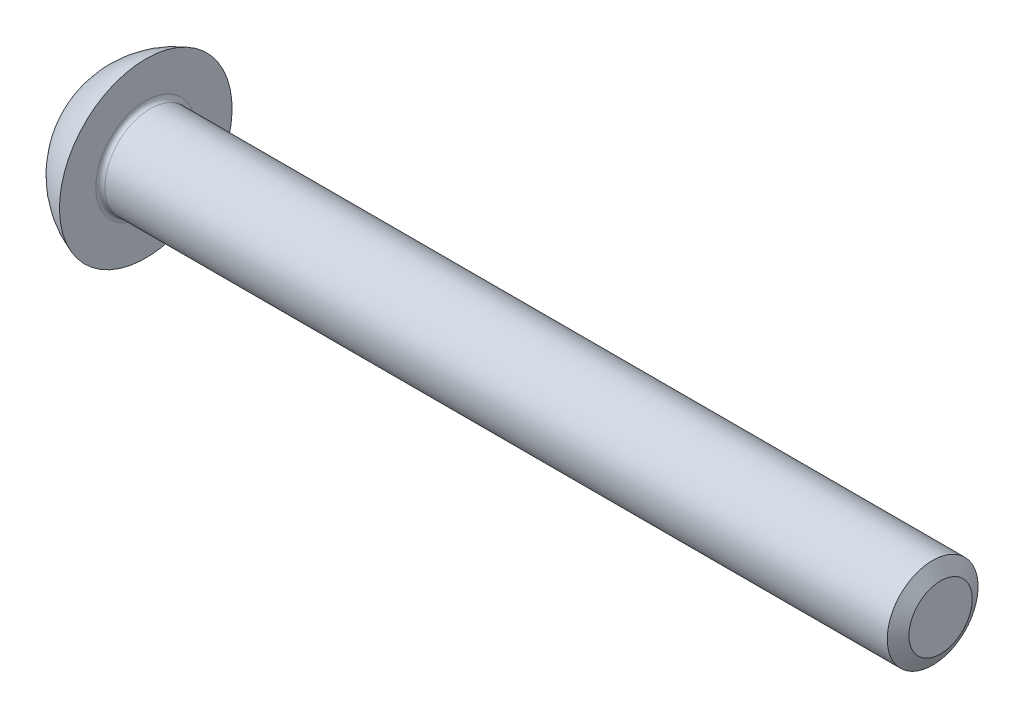
ISO-10303-21;
HEADER;
FILE_DESCRIPTION(('STEP AP214'),'2;1');
FILE_NAME('part.step','',(''),(''),'','','');
FILE_SCHEMA(('AUTOMOTIVE_DESIGN { 1 0 10303 214 1 1 1 1 }'));
ENDSEC;
DATA;
#1=APPLICATION_CONTEXT('core data for automotive mechanical design processes');
#2=APPLICATION_PROTOCOL_DEFINITION('international standard','automotive_design',2000,#1);
#3=PRODUCT_CONTEXT('',#1,'mechanical');
#4=PRODUCT('Part','Part','',(#3));
#5=PRODUCT_RELATED_PRODUCT_CATEGORY('part','',(#4));
#6=PRODUCT_DEFINITION_FORMATION('','',#4);
#7=PRODUCT_DEFINITION_CONTEXT('part definition',#1,'design');
#8=PRODUCT_DEFINITION('design','',#6,#7);
#9=PRODUCT_DEFINITION_SHAPE('','',#8);
#10=(LENGTH_UNIT() NAMED_UNIT(*) SI_UNIT(.MILLI.,.METRE.));
#11=(NAMED_UNIT(*) PLANE_ANGLE_UNIT() SI_UNIT($,.RADIAN.));
#12=(NAMED_UNIT(*) SI_UNIT($,.STERADIAN.) SOLID_ANGLE_UNIT());
#13=UNCERTAINTY_MEASURE_WITH_UNIT(LENGTH_MEASURE(1.E-05),#10,'distance_accuracy_value','');
#14=(GEOMETRIC_REPRESENTATION_CONTEXT(3) GLOBAL_UNCERTAINTY_ASSIGNED_CONTEXT((#13)) GLOBAL_UNIT_ASSIGNED_CONTEXT((#10,
#11,#12)) REPRESENTATION_CONTEXT('',''));
#15=CARTESIAN_POINT('',(0.,0.,0.));
#16=DIRECTION('',(0.,0.,1.));
#17=DIRECTION('',(1.,0.,0.));
#18=AXIS2_PLACEMENT_3D('',#15,#16,#17);
#19=CARTESIAN_POINT('',(-37.2,0.,0.));
#20=DIRECTION('',(-1.,0.,0.));
#21=DIRECTION('',(0.,0.,1.));
#22=AXIS2_PLACEMENT_3D('',#19,#20,#21);
#23=CYLINDRICAL_SURFACE('',#22,2.);
#24=CARTESIAN_POINT('',(-34.8,0.,0.));
#25=DIRECTION('',(-1.,0.,0.));
#26=DIRECTION('',(0.,0.,1.));
#27=AXIS2_PLACEMENT_3D('',#24,#25,#26);
#28=CIRCLE('',#27,2.);
#29=CARTESIAN_POINT('',(-34.8,0.,2.));
#30=VERTEX_POINT('',#29);
#31=EDGE_CURVE('E262',#30,#30,#28,.T.);
#32=ORIENTED_EDGE('',*,*,#31,.F.);
#33=EDGE_LOOP('',(#32));
#34=FACE_BOUND('',#33,.T.);
#35=CARTESIAN_POINT('',(-0.35,0.,0.));
#36=DIRECTION('',(-1.,0.,0.));
#37=DIRECTION('',(0.,0.,1.));
#38=AXIS2_PLACEMENT_3D('',#35,#36,#37);
#39=CIRCLE('',#38,2.);
#40=CARTESIAN_POINT('',(-0.35,0.,2.));
#41=VERTEX_POINT('',#40);
#42=EDGE_CURVE('E449',#41,#41,#39,.T.);
#43=ORIENTED_EDGE('',*,*,#42,.T.);
#44=EDGE_LOOP('',(#43));
#45=FACE_BOUND('',#44,.T.);
#46=ADVANCED_FACE('F41',(#34,#45),#23,.T.);
#47=CARTESIAN_POINT('',(-37.2,0.,0.));
#48=DIRECTION('',(1.,0.,0.));
#49=DIRECTION('',(0.,0.,-1.));
#50=AXIS2_PLACEMENT_3D('',#47,#48,#49);
#51=PLANE('',#50);
#52=CARTESIAN_POINT('',(-37.2,0.,0.));
#53=DIRECTION('',(-1.,0.,0.));
#54=DIRECTION('',(0.,0.,1.));
#55=AXIS2_PLACEMENT_3D('',#52,#53,#54);
#56=CIRCLE('',#55,2.);
#57=CARTESIAN_POINT('',(-37.2,2.,0.));
#58=VERTEX_POINT('',#57);
#59=EDGE_CURVE('E254',#58,#58,#56,.T.);
#60=ORIENTED_EDGE('',*,*,#59,.T.);
#61=EDGE_LOOP('',(#60));
#62=FACE_BOUND('',#61,.T.);
#63=CARTESIAN_POINT('',(-37.2,0.,0.));
#64=DIRECTION('',(1.,0.,0.));
#65=DIRECTION('',(0.,0.,-1.));
#66=AXIS2_PLACEMENT_3D('',#63,#64,#65);
#67=CIRCLE('',#66,1.44337567297406);
#68=CARTESIAN_POINT('',(-37.2,-0.721687836487033,-1.25));
#69=VERTEX_POINT('',#68);
#70=CARTESIAN_POINT('',(-37.2,-1.44337567297406,0.));
#71=VERTEX_POINT('',#70);
#72=EDGE_CURVE('E11',#69,#71,#67,.F.);
#73=ORIENTED_EDGE('',*,*,#72,.F.);
#74=CARTESIAN_POINT('',(-37.2,0.721687836487032,-1.25));
#75=VERTEX_POINT('',#74);
#76=EDGE_CURVE('E45',#75,#69,#67,.F.);
#77=ORIENTED_EDGE('',*,*,#76,.F.);
#78=CARTESIAN_POINT('',(-37.2,1.44337567297406,0.));
#79=VERTEX_POINT('',#78);
#80=EDGE_CURVE('E114',#79,#75,#67,.F.);
#81=ORIENTED_EDGE('',*,*,#80,.F.);
#82=CARTESIAN_POINT('',(-37.2,0.721687836487032,1.25));
#83=VERTEX_POINT('',#82);
#84=EDGE_CURVE('E327',#83,#79,#67,.F.);
#85=ORIENTED_EDGE('',*,*,#84,.F.);
#86=CARTESIAN_POINT('',(-37.2,-0.721687836487031,1.25));
#87=VERTEX_POINT('',#86);
#88=EDGE_CURVE('E50',#87,#83,#67,.F.);
#89=ORIENTED_EDGE('',*,*,#88,.F.);
#90=CARTESIAN_POINT('',(-37.2,0.,0.));
#91=DIRECTION('',(-1.,0.,0.));
#92=DIRECTION('',(0.,-1.,0.));
#93=AXIS2_PLACEMENT_3D('',#90,#91,#92);
#94=CIRCLE('',#93,1.44337567297406);
#95=EDGE_CURVE('E117',#71,#87,#94,.T.);
#96=ORIENTED_EDGE('',*,*,#95,.F.);
#97=EDGE_LOOP('',(#73,#77,#81,#85,#89,#96));
#98=FACE_BOUND('',#97,.T.);
#99=ADVANCED_FACE('F43',(#62,#98),#51,.F.);
#100=CARTESIAN_POINT('',(-33.7272727272727,0.,0.));
#101=DIRECTION('',(-1.,0.,0.));
#102=DIRECTION('',(0.,1.,0.));
#103=AXIS2_PLACEMENT_3D('',#100,#101,#102);
#104=SPHERICAL_SURFACE('',#103,4.00747235932374);
#105=CARTESIAN_POINT('',(-35.,0.,0.));
#106=DIRECTION('',(-1.,0.,0.));
#107=DIRECTION('',(0.,0.,1.));
#108=AXIS2_PLACEMENT_3D('',#105,#106,#107);
#109=CIRCLE('',#108,3.8);
#110=CARTESIAN_POINT('',(-35.,3.8,0.));
#111=VERTEX_POINT('',#110);
#112=EDGE_CURVE('E257',#111,#111,#109,.T.);
#113=CARTESIAN_POINT('',(-37.2,2.,0.));
#114=CARTESIAN_POINT('',(-37.1848940441993,2.02622955900731,0.));
#115=CARTESIAN_POINT('',(-37.1694908144314,2.05228791024859,0.));
#116=CARTESIAN_POINT('',(-37.1380979525594,2.10404896261473,0.));
#117=CARTESIAN_POINT('',(-37.1221083204554,2.12975166373959,0.));
#118=CARTESIAN_POINT('',(-37.0895507995097,2.18078818128854,0.));
#119=CARTESIAN_POINT('',(-37.072982910668,2.20612199771263,0.));
#120=CARTESIAN_POINT('',(-37.0392773993975,2.25640774959029,0.));
#121=CARTESIAN_POINT('',(-37.0221397769687,2.28135968504387,0.));
#122=CARTESIAN_POINT('',(-36.9873035925655,2.33086886166224,0.));
#123=CARTESIAN_POINT('',(-36.9696050305911,2.35542610282703,0.));
#124=CARTESIAN_POINT('',(-36.9336560549214,2.40413328370188,0.));
#125=CARTESIAN_POINT('',(-36.9154056412261,2.42828322341194,0.));
#126=CARTESIAN_POINT('',(-36.8783623317131,2.47616340238235,0.));
#127=CARTESIAN_POINT('',(-36.8595694358953,2.49989364164271,0.));
#128=CARTESIAN_POINT('',(-36.8214508106667,2.54692223644896,0.));
#129=CARTESIAN_POINT('',(-36.8021250812559,2.57022059199485,0.));
#130=CARTESIAN_POINT('',(-36.7629507108208,2.61637345777279,0.));
#131=CARTESIAN_POINT('',(-36.7431020697966,2.63922796800484,0.));
#132=CARTESIAN_POINT('',(-36.7028920666117,2.684481409448,0.));
#133=CARTESIAN_POINT('',(-36.682530704451,2.70688034065911,0.));
#134=CARTESIAN_POINT('',(-36.6413057126977,2.75121112424682,0.));
#135=CARTESIAN_POINT('',(-36.6204420831052,2.77314297662341,0.));
#136=CARTESIAN_POINT('',(-36.5782232680636,2.81652834253228,0.));
#137=CARTESIAN_POINT('',(-36.5568680826145,2.83798185606455,0.));
#138=CARTESIAN_POINT('',(-36.5136771198039,2.88039952985806,0.));
#139=CARTESIAN_POINT('',(-36.4918413424423,2.90136369011931,0.));
#140=CARTESIAN_POINT('',(-36.447700406491,2.94279189418254,0.));
#141=CARTESIAN_POINT('',(-36.4253952479013,2.96325593798452,0.));
#142=CARTESIAN_POINT('',(-36.3803270011625,3.00367340270525,0.));
#143=CARTESIAN_POINT('',(-36.3575639130134,3.02362682362399,0.));
#144=CARTESIAN_POINT('',(-36.3115914939299,3.06301279831264,0.));
#145=CARTESIAN_POINT('',(-36.2883821629955,3.08244535208254,0.));
#146=CARTESIAN_POINT('',(-36.2415291742204,3.12077961562579,0.));
#147=CARTESIAN_POINT('',(-36.2178855163797,3.13968132539914,0.));
#148=CARTESIAN_POINT('',(-36.1701760126585,3.17694419664163,0.));
#149=CARTESIAN_POINT('',(-36.1461101667779,3.19530535811078,0.));
#150=CARTESIAN_POINT('',(-36.0975686425984,3.23147770595957,0.));
#151=CARTESIAN_POINT('',(-36.0730929642995,3.24928889233922,0.));
#152=CARTESIAN_POINT('',(-36.0237443413165,3.28435214558591,0.));
#153=CARTESIAN_POINT('',(-35.9988713966324,3.30160421245294,0.));
#154=CARTESIAN_POINT('',(-35.9487410108723,3.3355403693082,0.));
#155=CARTESIAN_POINT('',(-35.9234835697963,3.35222445929642,0.));
#156=CARTESIAN_POINT('',(-35.8725971586496,3.38501609663248,0.));
#157=CARTESIAN_POINT('',(-35.846968188579,3.40112364398032,0.));
#158=CARTESIAN_POINT('',(-35.7953518775864,3.43275392627555,0.));
#159=CARTESIAN_POINT('',(-35.7693645366645,3.44827666122294,0.));
#160=CARTESIAN_POINT('',(-35.7170448261044,3.47872934920754,0.));
#161=CARTESIAN_POINT('',(-35.6907124564662,3.49365930224475,0.));
#162=CARTESIAN_POINT('',(-35.6377162077463,3.52291876123,0.));
#163=CARTESIAN_POINT('',(-35.6110523286645,3.53724826717804,0.));
#164=CARTESIAN_POINT('',(-35.5574067505418,3.56529947511373,0.));
#165=CARTESIAN_POINT('',(-35.5304250515009,3.57902117710138,0.));
#166=CARTESIAN_POINT('',(-35.4761576860719,3.60584973217452,0.));
#167=CARTESIAN_POINT('',(-35.4488720196837,3.61895658526001,0.));
#168=CARTESIAN_POINT('',(-35.3940107283966,3.6445487137135,0.));
#169=CARTESIAN_POINT('',(-35.3664351034975,3.65703398908152,0.));
#170=CARTESIAN_POINT('',(-35.3110080522769,3.6813765507008,0.));
#171=CARTESIAN_POINT('',(-35.2831566259553,3.69323383695206,0.));
#172=CARTESIAN_POINT('',(-35.2271922728732,3.71631433772655,0.));
#173=CARTESIAN_POINT('',(-35.1990793461126,3.72753755224977,0.));
#174=CARTESIAN_POINT('',(-35.1426064188229,3.74934412871163,0.));
#175=CARTESIAN_POINT('',(-35.1142464182937,3.75992749065027,0.));
#176=CARTESIAN_POINT('',(-35.0572939289701,3.78044899835327,0.));
#177=CARTESIAN_POINT('',(-35.0287014401756,3.79038714411763,0.));
#178=CARTESIAN_POINT('',(-35.,3.8,0.));
#179=B_SPLINE_CURVE_WITH_KNOTS('',3,(#113,#114,#115,#116,#117,#118,#119,#120,#121,#122,#123,
#124,#125,#126,#127,#128,#129,#130,#131,#132,#133,#134,#135,#136,#137,#138,#139,#140,#141,#142,
#143,#144,#145,#146,#147,#148,#149,#150,#151,#152,#153,#154,#155,#156,#157,#158,#159,#160,#161,
#162,#163,#164,#165,#166,#167,#168,#169,#170,#171,#172,#173,#174,#175,#176,#177,#178),
.UNSPECIFIED.,.F.,.F.,(4,2,2,2,2,2,2,2,2,2,2,2,2,2,2,2,2,2,2,2,2,2,2,2,2,2,2,2,2,2,2,2,4),(0.,
0.0908034330338798,0.18160686606776,0.272410299101639,0.36321373213552,0.454017165169397,
0.544820598203278,0.635624031237157,0.726427464271039,0.817230897304916,0.908034330338796,
0.998837763372676,1.08964119640656,1.18044462944043,1.27124806247431,1.36205149550819,
1.45285492854207,1.54365836157595,1.63446179460983,1.72526522764371,1.81606866067759,
1.90687209371147,1.99767552674535,2.08847895977923,2.17928239281311,2.27008582584699,
2.36088925888087,2.45169269191475,2.54249612494862,2.63329955798251,2.72410299101638,
2.81490642405027,2.90570985708415),.UNSPECIFIED.);
#180=EDGE_CURVE('BSEAM243',#58,#111,#179,.T.);
#181=ORIENTED_EDGE('',*,*,#59,.F.);
#182=ORIENTED_EDGE('',*,*,#112,.T.);
#183=ORIENTED_EDGE('',*,*,#180,.T.);
#184=ORIENTED_EDGE('',*,*,#180,.F.);
#185=EDGE_LOOP('',(#181,#183,#182,#184));
#186=FACE_BOUND('',#185,.T.);
#187=ADVANCED_FACE('F243',(#186),#104,.T.);
#188=CARTESIAN_POINT('',(-35.,2.2,0.));
#189=DIRECTION('',(-1.,0.,0.));
#190=DIRECTION('',(0.,0.,1.));
#191=AXIS2_PLACEMENT_3D('',#188,#189,#190);
#192=PLANE('',#191);
#193=ORIENTED_EDGE('',*,*,#112,.F.);
#194=EDGE_LOOP('',(#193));
#195=FACE_BOUND('',#194,.T.);
#196=CARTESIAN_POINT('',(-35.,0.,0.));
#197=DIRECTION('',(-1.,0.,0.));
#198=DIRECTION('',(0.,0.,1.));
#199=AXIS2_PLACEMENT_3D('',#196,#197,#198);
#200=CIRCLE('',#199,2.2);
#201=CARTESIAN_POINT('',(-35.,0.,2.2));
#202=VERTEX_POINT('',#201);
#203=EDGE_CURVE('E258',#202,#202,#200,.T.);
#204=ORIENTED_EDGE('',*,*,#203,.T.);
#205=EDGE_LOOP('',(#204));
#206=FACE_BOUND('',#205,.T.);
#207=ADVANCED_FACE('F240',(#195,#206),#192,.F.);
#208=CARTESIAN_POINT('',(-34.8,0.,0.));
#209=DIRECTION('',(-1.,0.,0.));
#210=DIRECTION('',(0.,0.,1.));
#211=AXIS2_PLACEMENT_3D('',#208,#209,#210);
#212=TOROIDAL_SURFACE('',#211,2.2,0.2);
#213=ORIENTED_EDGE('',*,*,#203,.F.);
#214=EDGE_LOOP('',(#213));
#215=FACE_BOUND('',#214,.T.);
#216=ORIENTED_EDGE('',*,*,#31,.T.);
#217=EDGE_LOOP('',(#216));
#218=FACE_BOUND('',#217,.T.);
#219=ADVANCED_FACE('F237',(#215,#218),#212,.F.);
#220=CARTESIAN_POINT('',(-36.83,0.,0.));
#221=DIRECTION('',(-1.,0.,0.));
#222=DIRECTION('',(0.,-1.,0.));
#223=AXIS2_PLACEMENT_3D('',#220,#221,#222);
#224=CONICAL_SURFACE('',#223,0.,1.31985626102756);
#225=CARTESIAN_POINT('',(-37.4099346759325,-1.88564456107599,-1.25));
#226=CARTESIAN_POINT('',(-37.3978717207476,-1.82917708741649,-1.25));
#227=CARTESIAN_POINT('',(-37.3859628503841,-1.7726766725723,-1.25));
#228=CARTESIAN_POINT('',(-37.3625309817374,-1.65959353753871,-1.25));
#229=CARTESIAN_POINT('',(-37.3510079994509,-1.60301081403846,-1.25));
#230=CARTESIAN_POINT('',(-37.3171150455956,-1.43301680255399,-1.25));
#231=CARTESIAN_POINT('',(-37.2954436732229,-1.31946408423816,-1.25));
#232=CARTESIAN_POINT('',(-37.2550957638519,-1.09274070822473,-1.25));
#233=CARTESIAN_POINT('',(-37.2363969731627,-0.979574090908787,-1.25));
#234=CARTESIAN_POINT('',(-37.2032623365578,-0.752620098767594,-1.25));
#235=CARTESIAN_POINT('',(-37.188825705465,-0.638832842215423,-1.25));
#236=CARTESIAN_POINT('',(-37.1660896767959,-0.409425109570645,-1.25));
#237=CARTESIAN_POINT('',(-37.1578544497063,-0.293797778292055,-1.25));
#238=CARTESIAN_POINT('',(-37.1515679025376,-0.120164512871691,-1.25));
#239=CARTESIAN_POINT('',(-37.150483164521,-0.0622627928697099,-1.25));
#240=CARTESIAN_POINT('',(-37.1503795328621,0.0535425643634284,-1.25));
#241=CARTESIAN_POINT('',(-37.1513606413601,0.11144620159651,-1.25));
#242=CARTESIAN_POINT('',(-37.1573598650309,0.285474295611227,-1.25));
#243=CARTESIAN_POINT('',(-37.1654487463646,0.401498867331895,-1.25));
#244=CARTESIAN_POINT('',(-37.1881044285101,0.632939913567419,-1.25));
#245=CARTESIAN_POINT('',(-37.2026754362751,0.748355943831211,-1.25));
#246=CARTESIAN_POINT('',(-37.2365518645336,0.980878548339561,-1.25));
#247=CARTESIAN_POINT('',(-37.2559479393881,1.09797147869704,-1.25));
#248=CARTESIAN_POINT('',(-37.297694705209,1.33163516353435,-1.25));
#249=CARTESIAN_POINT('',(-37.3200458280349,1.44820583911091,-1.25));
#250=CARTESIAN_POINT('',(-37.3666691464558,1.68099121637415,-1.25));
#251=CARTESIAN_POINT('',(-37.3909418646374,1.7972058122361,-1.25));
#252=CARTESIAN_POINT('',(-37.4407644332086,2.02936144854685,-1.25));
#253=CARTESIAN_POINT('',(-37.4663143094331,2.14530248341221,-1.25));
#254=CARTESIAN_POINT('',(-37.518006571917,2.37571314631909,-1.25));
#255=CARTESIAN_POINT('',(-37.5441393559518,2.49018493743662,-1.25));
#256=CARTESIAN_POINT('',(-37.5970181249123,2.71898894131965,-1.25));
#257=CARTESIAN_POINT('',(-37.6237641225282,2.83332115114489,-1.25));
#258=CARTESIAN_POINT('',(-37.6776683130688,3.06173187864781,-1.25));
#259=CARTESIAN_POINT('',(-37.7048259274931,3.17581053313172,-1.25));
#260=CARTESIAN_POINT('',(-37.7594820608418,3.40388218743046,-1.25));
#261=CARTESIAN_POINT('',(-37.7869805683896,3.51787518996983,-1.25));
#262=CARTESIAN_POINT('',(-37.8145979060137,3.63183906574753,-1.25));
#263=B_SPLINE_CURVE_WITH_KNOTS('',3,(#225,#226,#227,#228,#229,#230,#231,#232,#233,#234,#235,
#236,#237,#238,#239,#240,#241,#242,#243,#244,#245,#246,#247,#248,#249,#250,#251,#252,#253,#254,
#255,#256,#257,#258,#259,#260,#261,#262),.UNSPECIFIED.,.F.,.F.,(4,2,2,2,2,2,2,2,2,2,2,2,2,2,2,2,
2,2,4),(0.,0.173224298995283,0.346455770019721,0.69323917118921,1.03728991141695,
1.38127723083866,1.72877689604066,1.90247833739643,2.07617995870962,2.42483219738435,
2.77371104508348,3.12971850144864,3.48577804345033,3.84193475233926,4.19809866864176,
4.55034691705481,4.90260246171337,5.25440194240086,5.60618971383706),.UNSPECIFIED.);
#264=EDGE_CURVE('E105',#69,#75,#263,.T.);
#265=ORIENTED_EDGE('',*,*,#264,.T.);
#266=ORIENTED_EDGE('',*,*,#76,.T.);
#267=EDGE_LOOP('',(#265,#266));
#268=FACE_BOUND('',#267,.T.);
#269=ADVANCED_FACE('F109',(#268),#224,.F.);
#270=CARTESIAN_POINT('',(-37.2000296035517,0.721572366433194,-1.2502));
#271=CARTESIAN_POINT('',(-37.1923376245114,0.751560236122211,-1.19825948608787));
#272=CARTESIAN_POINT('',(-37.1853558988612,0.781597955311094,-1.14623263030924));
#273=CARTESIAN_POINT('',(-37.1730912390252,0.841770545746216,-1.04201064645257));
#274=CARTESIAN_POINT('',(-37.1678089341386,0.871905448817342,-0.989815463252219));
#275=CARTESIAN_POINT('',(-37.1592477971586,0.932104975245319,-0.885546824887376));
#276=CARTESIAN_POINT('',(-37.1559596086559,0.96216925702196,-0.833473961357168));
#277=CARTESIAN_POINT('',(-37.1515506008694,1.0223329488635,-0.729267390316703));
#278=CARTESIAN_POINT('',(-37.1504293994002,1.05243235179702,-0.677133695158352));
#279=CARTESIAN_POINT('',(-37.1504293994002,1.11263115766407,-0.572866304841649));
#280=CARTESIAN_POINT('',(-37.1515506008694,1.1427305605976,-0.520732609683297));
#281=CARTESIAN_POINT('',(-37.1559596086559,1.20289425243914,-0.416526038642832));
#282=CARTESIAN_POINT('',(-37.1592477971586,1.23295853421578,-0.364453175112624));
#283=CARTESIAN_POINT('',(-37.1678089341386,1.29315806064375,-0.260184536747782));
#284=CARTESIAN_POINT('',(-37.1730912390252,1.32329296371488,-0.207989353547428));
#285=CARTESIAN_POINT('',(-37.1853558988612,1.38346555415,-0.103767369690763));
#286=CARTESIAN_POINT('',(-37.1923376245114,1.41350327333889,-0.0517405139121324));
#287=CARTESIAN_POINT('',(-37.2000296035517,1.4434911430279,0.000199999999999419));
#288=B_SPLINE_CURVE_WITH_KNOTS('',3,(#270,#271,#272,#273,#274,#275,#276,#277,#278,#279,#280,
#281,#282,#283,#284,#285,#286,#287),.UNSPECIFIED.,.F.,.F.,(4,2,2,2,2,2,2,2,4),(0.,
0.181409592460798,0.362886284169926,0.543504761741732,0.724091381228726,0.90467800071572,
1.08529647828753,1.26677316999665,1.44818276245745),.UNSPECIFIED.);
#289=EDGE_CURVE('E133',#75,#79,#288,.T.);
#290=ORIENTED_EDGE('',*,*,#289,.T.);
#291=ORIENTED_EDGE('',*,*,#80,.T.);
#292=EDGE_LOOP('',(#290,#291));
#293=FACE_BOUND('',#292,.T.);
#294=ADVANCED_FACE('F161',(#293),#224,.F.);
#295=CARTESIAN_POINT('',(-37.2000296035517,1.4434911430279,-0.00019999999999983));
#296=CARTESIAN_POINT('',(-37.1923376245114,1.41350327333889,0.0517405139121321));
#297=CARTESIAN_POINT('',(-37.1853558988612,1.38346555415,0.103767369690763));
#298=CARTESIAN_POINT('',(-37.1730912390252,1.32329296371488,0.207989353547427));
#299=CARTESIAN_POINT('',(-37.1678089341386,1.29315806064375,0.260184536747781));
#300=CARTESIAN_POINT('',(-37.1592477971586,1.23295853421578,0.364453175112623));
#301=CARTESIAN_POINT('',(-37.1559596086559,1.20289425243914,0.416526038642832));
#302=CARTESIAN_POINT('',(-37.1515506008694,1.1427305605976,0.520732609683296));
#303=CARTESIAN_POINT('',(-37.1504293994002,1.11263115766407,0.572866304841648));
#304=CARTESIAN_POINT('',(-37.1504293994002,1.05243235179702,0.677133695158351));
#305=CARTESIAN_POINT('',(-37.1515506008694,1.0223329488635,0.729267390316703));
#306=CARTESIAN_POINT('',(-37.1559596086559,0.96216925702196,0.833473961357167));
#307=CARTESIAN_POINT('',(-37.1592477971586,0.93210497524532,0.885546824887375));
#308=CARTESIAN_POINT('',(-37.1678089341386,0.871905448817342,0.989815463252218));
#309=CARTESIAN_POINT('',(-37.1730912390252,0.841770545746216,1.04201064645257));
#310=CARTESIAN_POINT('',(-37.1853558988612,0.781597955311094,1.14623263030924));
#311=CARTESIAN_POINT('',(-37.1923376245114,0.751560236122212,1.19825948608787));
#312=CARTESIAN_POINT('',(-37.2000296035517,0.721572366433195,1.2502));
#313=B_SPLINE_CURVE_WITH_KNOTS('',3,(#295,#296,#297,#298,#299,#300,#301,#302,#303,#304,#305,
#306,#307,#308,#309,#310,#311,#312),.UNSPECIFIED.,.F.,.F.,(4,2,2,2,2,2,2,2,4),(0.,
0.181409592460798,0.362886284169926,0.543504761741731,0.724091381228726,0.904678000715719,
1.08529647828752,1.26677316999665,1.44818276245745),.UNSPECIFIED.);
#314=EDGE_CURVE('E183',#79,#83,#313,.T.);
#315=ORIENTED_EDGE('',*,*,#314,.T.);
#316=ORIENTED_EDGE('',*,*,#84,.T.);
#317=EDGE_LOOP('',(#315,#316));
#318=FACE_BOUND('',#317,.T.);
#319=ADVANCED_FACE('F155',(#318),#224,.F.);
#320=CARTESIAN_POINT('',(-37.4099346759325,-1.88564456107599,1.25));
#321=CARTESIAN_POINT('',(-37.3978717207476,-1.82917708741649,1.25));
#322=CARTESIAN_POINT('',(-37.3859628503841,-1.7726766725723,1.25));
#323=CARTESIAN_POINT('',(-37.3625309817374,-1.65959353753871,1.25));
#324=CARTESIAN_POINT('',(-37.3510079994509,-1.60301081403846,1.25));
#325=CARTESIAN_POINT('',(-37.3171150455956,-1.43301680255399,1.25));
#326=CARTESIAN_POINT('',(-37.2954436732229,-1.31946408423816,1.25));
#327=CARTESIAN_POINT('',(-37.2550957638519,-1.09274070822473,1.25));
#328=CARTESIAN_POINT('',(-37.2363969731627,-0.979574090908786,1.25));
#329=CARTESIAN_POINT('',(-37.2032623365578,-0.752620098767593,1.25));
#330=CARTESIAN_POINT('',(-37.188825705465,-0.638832842215423,1.25));
#331=CARTESIAN_POINT('',(-37.1660896767959,-0.409425109570646,1.25));
#332=CARTESIAN_POINT('',(-37.1578544497063,-0.293797778292055,1.25));
#333=CARTESIAN_POINT('',(-37.1515679025376,-0.120164512871691,1.25));
#334=CARTESIAN_POINT('',(-37.150483164521,-0.0622627928697106,1.25));
#335=CARTESIAN_POINT('',(-37.1503795328621,0.0535425643634278,1.25));
#336=CARTESIAN_POINT('',(-37.1513606413601,0.11144620159651,1.25));
#337=CARTESIAN_POINT('',(-37.1573598650309,0.285474295611226,1.25));
#338=CARTESIAN_POINT('',(-37.1654487463646,0.401498867331894,1.25));
#339=CARTESIAN_POINT('',(-37.1881044285101,0.632939913567419,1.25));
#340=CARTESIAN_POINT('',(-37.2026754362751,0.748355943831211,1.25));
#341=CARTESIAN_POINT('',(-37.2365518645336,0.980878548339561,1.25));
#342=CARTESIAN_POINT('',(-37.2559479393881,1.09797147869704,1.25));
#343=CARTESIAN_POINT('',(-37.297694705209,1.33163516353435,1.25));
#344=CARTESIAN_POINT('',(-37.3200458280349,1.44820583911091,1.25));
#345=CARTESIAN_POINT('',(-37.3666691464558,1.68099121637415,1.25));
#346=CARTESIAN_POINT('',(-37.3909418646374,1.7972058122361,1.25));
#347=CARTESIAN_POINT('',(-37.4407644332086,2.02936144854685,1.25));
#348=CARTESIAN_POINT('',(-37.4663143094331,2.14530248341221,1.25));
#349=CARTESIAN_POINT('',(-37.518006571917,2.37571314631909,1.25));
#350=CARTESIAN_POINT('',(-37.5441393559518,2.49018493743662,1.25));
#351=CARTESIAN_POINT('',(-37.5970181249123,2.71898894131965,1.25));
#352=CARTESIAN_POINT('',(-37.6237641225282,2.83332115114489,1.25));
#353=CARTESIAN_POINT('',(-37.6776683130688,3.06173187864781,1.25));
#354=CARTESIAN_POINT('',(-37.7048259274931,3.17581053313172,1.25));
#355=CARTESIAN_POINT('',(-37.7594820608418,3.40388218743046,1.25));
#356=CARTESIAN_POINT('',(-37.7869805683896,3.51787518996983,1.25));
#357=CARTESIAN_POINT('',(-37.8145979060137,3.63183906574753,1.25));
#358=B_SPLINE_CURVE_WITH_KNOTS('',3,(#320,#321,#322,#323,#324,#325,#326,#327,#328,#329,#330,
#331,#332,#333,#334,#335,#336,#337,#338,#339,#340,#341,#342,#343,#344,#345,#346,#347,#348,#349,
#350,#351,#352,#353,#354,#355,#356,#357),.UNSPECIFIED.,.F.,.F.,(4,2,2,2,2,2,2,2,2,2,2,2,2,2,2,2,
2,2,4),(0.,0.173224298995283,0.346455770019721,0.69323917118921,1.03728991141696,
1.38127723083866,1.72877689604066,1.90247833739643,2.07617995870962,2.42483219738435,
2.77371104508348,3.12971850144864,3.48577804345033,3.84193475233926,4.19809866864176,
4.55034691705481,4.90260246171337,5.25440194240086,5.60618971383706),.UNSPECIFIED.);
#359=EDGE_CURVE('E62',#83,#87,#358,.F.);
#360=ORIENTED_EDGE('',*,*,#359,.T.);
#361=ORIENTED_EDGE('',*,*,#88,.T.);
#362=EDGE_LOOP('',(#360,#361));
#363=FACE_BOUND('',#362,.T.);
#364=ADVANCED_FACE('F160',(#363),#224,.F.);
#365=CARTESIAN_POINT('',(-37.2000296035517,-0.721572366433195,1.2502));
#366=CARTESIAN_POINT('',(-37.1923376245114,-0.751560236122212,1.19825948608787));
#367=CARTESIAN_POINT('',(-37.1853558988612,-0.781597955311095,1.14623263030924));
#368=CARTESIAN_POINT('',(-37.1730912390252,-0.841770545746217,1.04201064645257));
#369=CARTESIAN_POINT('',(-37.1678089341386,-0.871905448817343,0.989815463252219));
#370=CARTESIAN_POINT('',(-37.1592477971586,-0.93210497524532,0.885546824887376));
#371=CARTESIAN_POINT('',(-37.1559596086559,-0.962169257021961,0.833473961357168));
#372=CARTESIAN_POINT('',(-37.1515506008694,-1.0223329488635,0.729267390316703));
#373=CARTESIAN_POINT('',(-37.1504293994002,-1.05243235179702,0.677133695158351));
#374=CARTESIAN_POINT('',(-37.1504293994002,-1.11263115766407,0.572866304841648));
#375=CARTESIAN_POINT('',(-37.1515506008694,-1.1427305605976,0.520732609683297));
#376=CARTESIAN_POINT('',(-37.1559596086559,-1.20289425243914,0.416526038642832));
#377=CARTESIAN_POINT('',(-37.1592477971586,-1.23295853421578,0.364453175112623));
#378=CARTESIAN_POINT('',(-37.1678089341386,-1.29315806064376,0.260184536747781));
#379=CARTESIAN_POINT('',(-37.1730912390252,-1.32329296371488,0.207989353547428));
#380=CARTESIAN_POINT('',(-37.1853558988612,-1.38346555415,0.103767369690763));
#381=CARTESIAN_POINT('',(-37.1923376245114,-1.41350327333889,0.0517405139121318));
#382=CARTESIAN_POINT('',(-37.2000296035517,-1.4434911430279,-0.000200000000000009));
#383=B_SPLINE_CURVE_WITH_KNOTS('',3,(#365,#366,#367,#368,#369,#370,#371,#372,#373,#374,#375,
#376,#377,#378,#379,#380,#381,#382),.UNSPECIFIED.,.F.,.F.,(4,2,2,2,2,2,2,2,4),(0.,
0.181409592460797,0.362886284169926,0.543504761741732,0.724091381228726,0.90467800071572,
1.08529647828753,1.26677316999665,1.44818276245745),.UNSPECIFIED.);
#384=EDGE_CURVE('E56',#87,#71,#383,.T.);
#385=ORIENTED_EDGE('',*,*,#384,.T.);
#386=ORIENTED_EDGE('',*,*,#95,.T.);
#387=EDGE_LOOP('',(#385,#386));
#388=FACE_BOUND('',#387,.T.);
#389=ADVANCED_FACE('F314',(#388),#224,.F.);
#390=CARTESIAN_POINT('',(-37.2000296035517,-1.4434911430279,0.000199999999999256));
#391=CARTESIAN_POINT('',(-37.1923376245114,-1.41350327333889,-0.0517405139121324));
#392=CARTESIAN_POINT('',(-37.1853558988612,-1.38346555415,-0.103767369690763));
#393=CARTESIAN_POINT('',(-37.1730912390252,-1.32329296371488,-0.207989353547428));
#394=CARTESIAN_POINT('',(-37.1678089341386,-1.29315806064376,-0.260184536747782));
#395=CARTESIAN_POINT('',(-37.1592477971586,-1.23295853421578,-0.364453175112624));
#396=CARTESIAN_POINT('',(-37.1559596086559,-1.20289425243914,-0.416526038642832));
#397=CARTESIAN_POINT('',(-37.1515506008694,-1.1427305605976,-0.520732609683297));
#398=CARTESIAN_POINT('',(-37.1504293994002,-1.11263115766407,-0.572866304841649));
#399=CARTESIAN_POINT('',(-37.1504293994002,-1.05243235179703,-0.677133695158352));
#400=CARTESIAN_POINT('',(-37.1515506008694,-1.0223329488635,-0.729267390316703));
#401=CARTESIAN_POINT('',(-37.1559596086559,-0.962169257021961,-0.833473961357168));
#402=CARTESIAN_POINT('',(-37.1592477971586,-0.93210497524532,-0.885546824887376));
#403=CARTESIAN_POINT('',(-37.1678089341386,-0.871905448817343,-0.989815463252219));
#404=CARTESIAN_POINT('',(-37.1730912390252,-0.841770545746217,-1.04201064645257));
#405=CARTESIAN_POINT('',(-37.1853558988612,-0.781597955311095,-1.14623263030924));
#406=CARTESIAN_POINT('',(-37.1923376245114,-0.751560236122212,-1.19825948608787));
#407=CARTESIAN_POINT('',(-37.2000296035517,-0.721572366433195,-1.2502));
#408=B_SPLINE_CURVE_WITH_KNOTS('',3,(#390,#391,#392,#393,#394,#395,#396,#397,#398,#399,#400,
#401,#402,#403,#404,#405,#406,#407),.UNSPECIFIED.,.F.,.F.,(4,2,2,2,2,2,2,2,4),(0.,
0.181409592460797,0.362886284169926,0.543504761741732,0.724091381228726,0.90467800071572,
1.08529647828752,1.26677316999665,1.44818276245745),.UNSPECIFIED.);
#409=EDGE_CURVE('E97',#71,#69,#408,.T.);
#410=ORIENTED_EDGE('',*,*,#409,.T.);
#411=ORIENTED_EDGE('',*,*,#72,.T.);
#412=EDGE_LOOP('',(#410,#411));
#413=FACE_BOUND('',#412,.T.);
#414=ADVANCED_FACE('F99',(#413),#224,.F.);
#415=CARTESIAN_POINT('',(-35.9,0.,0.));
#416=DIRECTION('',(-1.,0.,0.));
#417=DIRECTION('',(0.,0.,1.));
#418=AXIS2_PLACEMENT_3D('',#415,#416,#417);
#419=CONICAL_SURFACE('',#418,1.44337567297406,1.01324881882863);
#420=CARTESIAN_POINT('',(-35.,0.,0.));
#421=VERTEX_POINT('',#420);
#422=VERTEX_LOOP('',#421);
#423=FACE_BOUND('',#422,.T.);
#424=CARTESIAN_POINT('',(-36.3527945795421,-1.77325319370586,1.25));
#425=CARTESIAN_POINT('',(-36.3272313608337,-1.72308054748254,1.25));
#426=CARTESIAN_POINT('',(-36.3019425610441,-1.67276579739611,1.25));
#427=CARTESIAN_POINT('',(-36.2520602884769,-1.57178113050656,1.25));
#428=CARTESIAN_POINT('',(-36.2274669508561,-1.52111114702254,1.25));
#429=CARTESIAN_POINT('',(-36.1789832389279,-1.41905106562434,1.25));
#430=CARTESIAN_POINT('',(-36.1550981267071,-1.36765845463947,1.25));
#431=CARTESIAN_POINT('',(-36.1084115654387,-1.26438731533743,1.25));
#432=CARTESIAN_POINT('',(-36.0856100580289,-1.21250881337054,1.25));
#433=CARTESIAN_POINT('',(-36.0180066296141,-1.05318865262781,1.25));
#434=CARTESIAN_POINT('',(-35.975348048821,-0.944818595736521,1.25));
#435=CARTESIAN_POINT('',(-35.899249765014,-0.725021793662274,1.25));
#436=CARTESIAN_POINT('',(-35.8657864364544,-0.613603706258268,1.25));
#437=CARTESIAN_POINT('',(-35.8255224000706,-0.439829475428555,1.25));
#438=CARTESIAN_POINT('',(-35.8135539759356,-0.378686784718627,1.25));
#439=CARTESIAN_POINT('',(-35.7946834115852,-0.255611326700575,1.25));
#440=CARTESIAN_POINT('',(-35.7877804723348,-0.193678685568828,1.25));
#441=CARTESIAN_POINT('',(-35.7797277447971,-0.0702459018996847,1.25));
#442=CARTESIAN_POINT('',(-35.7785036595021,-0.00875074655362669,1.25));
#443=CARTESIAN_POINT('',(-35.7817252928589,0.114091468273713,1.25));
#444=CARTESIAN_POINT('',(-35.7861717520863,0.175438507362528,1.25));
#445=CARTESIAN_POINT('',(-35.8027908211659,0.31879377456243,1.25));
#446=CARTESIAN_POINT('',(-35.8171162097553,0.40055050780021,1.25));
#447=CARTESIAN_POINT('',(-35.8533604743273,0.562357759535309,1.25));
#448=CARTESIAN_POINT('',(-35.8752859853004,0.642406722094853,1.25));
#449=CARTESIAN_POINT('',(-35.9252263796581,0.802612605575797,1.25));
#450=CARTESIAN_POINT('',(-35.9533725953862,0.882727610112279,1.25));
#451=CARTESIAN_POINT('',(-36.0137044102596,1.04136692759758,1.25));
#452=CARTESIAN_POINT('',(-36.0458888175979,1.11989170196819,1.25));
#453=CARTESIAN_POINT('',(-36.1085113010088,1.26504456834479,1.25));
#454=CARTESIAN_POINT('',(-36.1385863298607,1.33183108575291,1.25));
#455=CARTESIAN_POINT('',(-36.2003370421044,1.46466259424516,1.25));
#456=CARTESIAN_POINT('',(-36.2320128472902,1.53070752843773,1.25));
#457=CARTESIAN_POINT('',(-36.3288612944515,1.72800114412657,1.25));
#458=CARTESIAN_POINT('',(-36.3958346146514,1.85836304165698,1.25));
#459=CARTESIAN_POINT('',(-36.5327729293065,2.11775589592146,1.25));
#460=CARTESIAN_POINT('',(-36.6027425964556,2.24678435317969,1.25));
#461=CARTESIAN_POINT('',(-36.7445495255551,2.50377456749809,1.25));
#462=CARTESIAN_POINT('',(-36.8163864088467,2.63173653399053,1.25));
#463=CARTESIAN_POINT('',(-36.9535702802704,2.87326192040095,1.25));
#464=CARTESIAN_POINT('',(-37.0187879458601,2.98689907544955,1.25));
#465=CARTESIAN_POINT('',(-37.1499753350723,3.21374706697092,1.25));
#466=CARTESIAN_POINT('',(-37.2159451030052,3.32695787779728,1.25));
#467=CARTESIAN_POINT('',(-37.3482234067217,3.55267191020502,1.25));
#468=CARTESIAN_POINT('',(-37.4145300682268,3.66517623176316,1.25));
#469=CARTESIAN_POINT('',(-37.5475751113016,3.8899176768681,1.25));
#470=CARTESIAN_POINT('',(-37.6143134591135,4.00215482039119,1.25));
#471=CARTESIAN_POINT('',(-37.6812102093033,4.11429687203232,1.25));
#472=B_SPLINE_CURVE_WITH_KNOTS('',3,(#424,#425,#426,#427,#428,#429,#430,#431,#432,#433,#434,
#435,#436,#437,#438,#439,#440,#441,#442,#443,#444,#445,#446,#447,#448,#449,#450,#451,#452,#453,
#454,#455,#456,#457,#458,#459,#460,#461,#462,#463,#464,#465,#466,#467,#468,#469,#470,#471),
.UNSPECIFIED.,.F.,.F.,(4,2,2,2,2,2,2,2,2,2,2,2,2,2,2,2,2,2,2,2,2,2,2,4),(0.,0.168930888086683,
0.337894383813142,0.507898463482617,0.677893376465119,1.0270708628597,1.3753426286684,
1.56207832532889,1.74878455976038,1.93304107769939,2.11732166208063,2.36583389677494,
2.61456363408265,2.86915526427584,3.12367193182965,3.34338375168394,3.56311231342188,
4.0027191278184,4.44303841363042,4.88326909182565,5.27633168545271,5.66941755741552,
6.06118706475326,6.45292629749501),.UNSPECIFIED.);
#473=CARTESIAN_POINT('',(-35.9,-0.721687836487033,1.25));
#474=VERTEX_POINT('',#473);
#475=CARTESIAN_POINT('',(-35.9,0.721687836487032,1.25));
#476=VERTEX_POINT('',#475);
#477=EDGE_CURVE('E199',#474,#476,#472,.T.);
#478=ORIENTED_EDGE('',*,*,#477,.T.);
#479=CARTESIAN_POINT('',(-35.9000720086393,0.721572366433195,1.2502));
#480=CARTESIAN_POINT('',(-35.8801448426332,0.753515397677925,1.19487304693637));
#481=CARTESIAN_POINT('',(-35.8620045541367,0.785780040598703,1.13898904610951));
#482=CARTESIAN_POINT('',(-35.8303569142874,0.850965440737862,1.02608462115678));
#483=CARTESIAN_POINT('',(-35.8168631745157,0.883887831667605,0.96906136735982));
#484=CARTESIAN_POINT('',(-35.7960025510557,0.949256047226192,0.855840296812234));
#485=CARTESIAN_POINT('',(-35.7884697729694,0.981688121259104,0.799666296792394));
#486=CARTESIAN_POINT('',(-35.7796634350083,1.04672261963105,0.687023241367427));
#487=CARTESIAN_POINT('',(-35.7783805168214,1.07932471605451,0.630554753928728));
#488=CARTESIAN_POINT('',(-35.7819049641254,1.13967644186336,0.526022498503349));
#489=CARTESIAN_POINT('',(-35.7858507725259,1.167439811789,0.477934931202806));
#490=CARTESIAN_POINT('',(-35.7980757188124,1.22275387862577,0.382128157068257));
#491=CARTESIAN_POINT('',(-35.8063595984706,1.25030430927563,0.334409411412305));
#492=CARTESIAN_POINT('',(-35.826962668364,1.30574431848064,0.23838449869714));
#493=CARTESIAN_POINT('',(-35.8393795573722,1.333624575995,0.190094476154151));
#494=CARTESIAN_POINT('',(-35.8674628627124,1.38890731580299,0.0943419620251042));
#495=CARTESIAN_POINT('',(-35.8831216709794,1.41631075671776,0.0468778100585213));
#496=CARTESIAN_POINT('',(-35.9000720086393,1.4434911430279,-0.000200000000000081));
#497=B_SPLINE_CURVE_WITH_KNOTS('',3,(#479,#480,#481,#482,#483,#484,#485,#486,#487,#488,#489,
#490,#491,#492,#493,#494,#495,#496),.UNSPECIFIED.,.F.,.F.,(4,2,2,2,2,2,2,2,4),(0.,
0.200864252203221,0.402312007110809,0.597934215834183,0.793263416779518,0.960084042532225,
1.12708739503102,1.29835788316976,1.46923090317111),.UNSPECIFIED.);
#498=CARTESIAN_POINT('',(-35.9,1.44337567297406,0.));
#499=VERTEX_POINT('',#498);
#500=EDGE_CURVE('E207',#476,#499,#497,.T.);
#501=ORIENTED_EDGE('',*,*,#500,.T.);
#502=CARTESIAN_POINT('',(-35.9000720086393,1.4434911430279,0.000199999999999767));
#503=CARTESIAN_POINT('',(-35.8801448426332,1.41154811178317,-0.055126953063633));
#504=CARTESIAN_POINT('',(-35.8620045541367,1.37928346886239,-0.111010953890488));
#505=CARTESIAN_POINT('',(-35.8303569142874,1.31409806872323,-0.22391537884322));
#506=CARTESIAN_POINT('',(-35.8168631745157,1.28117567779349,-0.280938632640179));
#507=CARTESIAN_POINT('',(-35.7960025510557,1.2158074622349,-0.394159703187766));
#508=CARTESIAN_POINT('',(-35.7884697729694,1.18337538820199,-0.450333703207606));
#509=CARTESIAN_POINT('',(-35.7796634350083,1.11834088983005,-0.562976758632573));
#510=CARTESIAN_POINT('',(-35.7783805168214,1.08573879340658,-0.619445246071272));
#511=CARTESIAN_POINT('',(-35.7819049641254,1.02538706759774,-0.723977501496651));
#512=CARTESIAN_POINT('',(-35.7858507725259,0.997623697672098,-0.772065068797194));
#513=CARTESIAN_POINT('',(-35.7980757188124,0.942309630835326,-0.867871842931743));
#514=CARTESIAN_POINT('',(-35.8063595984706,0.914759200185471,-0.915590588587694));
#515=CARTESIAN_POINT('',(-35.826962668364,0.85931919098046,-1.01161550130286));
#516=CARTESIAN_POINT('',(-35.8393795573722,0.831438933466092,-1.05990552384585));
#517=CARTESIAN_POINT('',(-35.8674628627124,0.776156193658104,-1.1556580379749));
#518=CARTESIAN_POINT('',(-35.8831216709794,0.74875275274334,-1.20312218994148));
#519=CARTESIAN_POINT('',(-35.9000720086393,0.721572366433194,-1.2502));
#520=B_SPLINE_CURVE_WITH_KNOTS('',3,(#502,#503,#504,#505,#506,#507,#508,#509,#510,#511,#512,
#513,#514,#515,#516,#517,#518,#519),.UNSPECIFIED.,.F.,.F.,(4,2,2,2,2,2,2,2,4),(0.,
0.200864252203221,0.402312007110809,0.597934215834182,0.793263416779518,0.960084042532225,
1.12708739503102,1.29835788316976,1.46923090317111),.UNSPECIFIED.);
#521=CARTESIAN_POINT('',(-35.9,0.721687836487033,-1.25));
#522=VERTEX_POINT('',#521);
#523=EDGE_CURVE('E115',#499,#522,#520,.T.);
#524=ORIENTED_EDGE('',*,*,#523,.T.);
#525=CARTESIAN_POINT('',(-36.3527945795421,-1.77325319370587,-1.25));
#526=CARTESIAN_POINT('',(-36.3272313608337,-1.72308054748254,-1.25));
#527=CARTESIAN_POINT('',(-36.3019425610441,-1.67276579739611,-1.25));
#528=CARTESIAN_POINT('',(-36.2520602884769,-1.57178113050656,-1.25));
#529=CARTESIAN_POINT('',(-36.2274669508561,-1.52111114702254,-1.25));
#530=CARTESIAN_POINT('',(-36.1789832389279,-1.41905106562435,-1.25));
#531=CARTESIAN_POINT('',(-36.1550981267071,-1.36765845463947,-1.25));
#532=CARTESIAN_POINT('',(-36.1084115654387,-1.26438731533743,-1.25));
#533=CARTESIAN_POINT('',(-36.0856100580289,-1.21250881337054,-1.25));
#534=CARTESIAN_POINT('',(-36.0180066296141,-1.05318865262781,-1.25));
#535=CARTESIAN_POINT('',(-35.975348048821,-0.944818595736519,-1.25));
#536=CARTESIAN_POINT('',(-35.899249765014,-0.725021793662271,-1.25));
#537=CARTESIAN_POINT('',(-35.8657864364544,-0.613603706258266,-1.25));
#538=CARTESIAN_POINT('',(-35.8255224000706,-0.439829475428554,-1.25));
#539=CARTESIAN_POINT('',(-35.8135539759356,-0.378686784718625,-1.25));
#540=CARTESIAN_POINT('',(-35.7946834115852,-0.255611326700574,-1.25));
#541=CARTESIAN_POINT('',(-35.7877804723348,-0.193678685568827,-1.25));
#542=CARTESIAN_POINT('',(-35.7797277447971,-0.0702459018996843,-1.25));
#543=CARTESIAN_POINT('',(-35.7785036595021,-0.00875074655362655,-1.25));
#544=CARTESIAN_POINT('',(-35.7817252928589,0.114091468273713,-1.25));
#545=CARTESIAN_POINT('',(-35.7861717520863,0.175438507362528,-1.25));
#546=CARTESIAN_POINT('',(-35.8027908211659,0.318793774562429,-1.25));
#547=CARTESIAN_POINT('',(-35.8171162097553,0.400550507800209,-1.25));
#548=CARTESIAN_POINT('',(-35.8533604743273,0.562357759535307,-1.25));
#549=CARTESIAN_POINT('',(-35.8752859853004,0.642406722094851,-1.25));
#550=CARTESIAN_POINT('',(-35.9252263796581,0.802612605575796,-1.25));
#551=CARTESIAN_POINT('',(-35.9533725953862,0.882727610112277,-1.25));
#552=CARTESIAN_POINT('',(-36.0137044102596,1.04136692759758,-1.25));
#553=CARTESIAN_POINT('',(-36.0458888175979,1.11989170196818,-1.25));
#554=CARTESIAN_POINT('',(-36.1085113010088,1.26504456834479,-1.25));
#555=CARTESIAN_POINT('',(-36.1385863298607,1.33183108575291,-1.25));
#556=CARTESIAN_POINT('',(-36.2003370421044,1.46466259424516,-1.25));
#557=CARTESIAN_POINT('',(-36.2320128472902,1.53070752843773,-1.25));
#558=CARTESIAN_POINT('',(-36.3288612944515,1.72800114412657,-1.25));
#559=CARTESIAN_POINT('',(-36.3958346146514,1.85836304165698,-1.25));
#560=CARTESIAN_POINT('',(-36.5327729293065,2.11775589592146,-1.25));
#561=CARTESIAN_POINT('',(-36.6027425964556,2.24678435317969,-1.25));
#562=CARTESIAN_POINT('',(-36.7445495255551,2.50377456749809,-1.25));
#563=CARTESIAN_POINT('',(-36.8163864088467,2.63173653399053,-1.25));
#564=CARTESIAN_POINT('',(-36.9535702802704,2.87326192040095,-1.25));
#565=CARTESIAN_POINT('',(-37.0187879458601,2.98689907544955,-1.25));
#566=CARTESIAN_POINT('',(-37.1499753350723,3.21374706697092,-1.25));
#567=CARTESIAN_POINT('',(-37.2159451030052,3.32695787779728,-1.25));
#568=CARTESIAN_POINT('',(-37.3482234067217,3.55267191020502,-1.25));
#569=CARTESIAN_POINT('',(-37.4145300682268,3.66517623176316,-1.25));
#570=CARTESIAN_POINT('',(-37.5475751113016,3.8899176768681,-1.25));
#571=CARTESIAN_POINT('',(-37.6143134591135,4.00215482039119,-1.25));
#572=CARTESIAN_POINT('',(-37.6812102093033,4.11429687203232,-1.25));
#573=B_SPLINE_CURVE_WITH_KNOTS('',3,(#525,#526,#527,#528,#529,#530,#531,#532,#533,#534,#535,
#536,#537,#538,#539,#540,#541,#542,#543,#544,#545,#546,#547,#548,#549,#550,#551,#552,#553,#554,
#555,#556,#557,#558,#559,#560,#561,#562,#563,#564,#565,#566,#567,#568,#569,#570,#571,#572),
.UNSPECIFIED.,.F.,.F.,(4,2,2,2,2,2,2,2,2,2,2,2,2,2,2,2,2,2,2,2,2,2,2,4),(0.,0.168930888086683,
0.337894383813142,0.507898463482618,0.677893376465121,1.02707086285971,1.3753426286684,
1.5620783253289,1.74878455976038,1.93304107769939,2.11732166208063,2.36583389677494,
2.61456363408265,2.86915526427584,3.12367193182965,3.34338375168395,3.56311231342189,
4.0027191278184,4.44303841363042,4.88326909182565,5.27633168545271,5.66941755741553,
6.06118706475326,6.45292629749501),.UNSPECIFIED.);
#574=CARTESIAN_POINT('',(-35.9,-0.721687836487033,-1.25));
#575=VERTEX_POINT('',#574);
#576=EDGE_CURVE('E271',#522,#575,#573,.F.);
#577=ORIENTED_EDGE('',*,*,#576,.T.);
#578=CARTESIAN_POINT('',(-35.9000720086393,-0.721572366433195,-1.2502));
#579=CARTESIAN_POINT('',(-35.8801448426332,-0.753515397677925,-1.19487304693637));
#580=CARTESIAN_POINT('',(-35.8620045541367,-0.785780040598704,-1.13898904610951));
#581=CARTESIAN_POINT('',(-35.8303569142874,-0.850965440737863,-1.02608462115678));
#582=CARTESIAN_POINT('',(-35.8168631745157,-0.883887831667606,-0.969061367359821));
#583=CARTESIAN_POINT('',(-35.7960025510557,-0.949256047226193,-0.855840296812234));
#584=CARTESIAN_POINT('',(-35.7884697729694,-0.981688121259105,-0.799666296792394));
#585=CARTESIAN_POINT('',(-35.7796634350083,-1.04672261963105,-0.687023241367427));
#586=CARTESIAN_POINT('',(-35.7783805168214,-1.07932471605452,-0.630554753928728));
#587=CARTESIAN_POINT('',(-35.7819049641254,-1.13967644186336,-0.526022498503349));
#588=CARTESIAN_POINT('',(-35.7858507725259,-1.167439811789,-0.477934931202806));
#589=CARTESIAN_POINT('',(-35.7980757188124,-1.22275387862577,-0.382128157068257));
#590=CARTESIAN_POINT('',(-35.8063595984706,-1.25030430927563,-0.334409411412306));
#591=CARTESIAN_POINT('',(-35.826962668364,-1.30574431848064,-0.238384498697141));
#592=CARTESIAN_POINT('',(-35.8393795573722,-1.33362457599501,-0.190094476154151));
#593=CARTESIAN_POINT('',(-35.8674628627124,-1.38890731580299,-0.0943419620251048));
#594=CARTESIAN_POINT('',(-35.8831216709794,-1.41631075671776,-0.046877810058522));
#595=CARTESIAN_POINT('',(-35.9000720086393,-1.4434911430279,0.000199999999999518));
#596=B_SPLINE_CURVE_WITH_KNOTS('',3,(#578,#579,#580,#581,#582,#583,#584,#585,#586,#587,#588,
#589,#590,#591,#592,#593,#594,#595),.UNSPECIFIED.,.F.,.F.,(4,2,2,2,2,2,2,2,4),(0.,
0.200864252203221,0.40231200711081,0.597934215834183,0.793263416779518,0.960084042532225,
1.12708739503102,1.29835788316976,1.46923090317111),.UNSPECIFIED.);
#597=CARTESIAN_POINT('',(-35.9,-1.44337567297407,0.));
#598=VERTEX_POINT('',#597);
#599=EDGE_CURVE('E123',#575,#598,#596,.T.);
#600=ORIENTED_EDGE('',*,*,#599,.T.);
#601=CARTESIAN_POINT('',(-35.9000720086393,-1.4434911430279,-0.000200000000000587));
#602=CARTESIAN_POINT('',(-35.8801448426332,-1.41154811178317,0.0551269530636321));
#603=CARTESIAN_POINT('',(-35.8620045541367,-1.37928346886239,0.111010953890488));
#604=CARTESIAN_POINT('',(-35.8303569142874,-1.31409806872324,0.22391537884322));
#605=CARTESIAN_POINT('',(-35.8168631745157,-1.28117567779349,0.280938632640179));
#606=CARTESIAN_POINT('',(-35.7960025510557,-1.21580746223491,0.394159703187765));
#607=CARTESIAN_POINT('',(-35.7884697729694,-1.18337538820199,0.450333703207605));
#608=CARTESIAN_POINT('',(-35.7796634350083,-1.11834088983005,0.562976758632572));
#609=CARTESIAN_POINT('',(-35.7783805168214,-1.08573879340658,0.619445246071271));
#610=CARTESIAN_POINT('',(-35.7819049641254,-1.02538706759774,0.723977501496651));
#611=CARTESIAN_POINT('',(-35.7858507725259,-0.997623697672099,0.772065068797193));
#612=CARTESIAN_POINT('',(-35.7980757188124,-0.942309630835327,0.867871842931742));
#613=CARTESIAN_POINT('',(-35.8063595984706,-0.914759200185472,0.915590588587694));
#614=CARTESIAN_POINT('',(-35.826962668364,-0.859319190980461,1.01161550130286));
#615=CARTESIAN_POINT('',(-35.8393795573722,-0.831438933466093,1.05990552384585));
#616=CARTESIAN_POINT('',(-35.8674628627124,-0.776156193658105,1.1556580379749));
#617=CARTESIAN_POINT('',(-35.8831216709794,-0.748752752743341,1.20312218994148));
#618=CARTESIAN_POINT('',(-35.9000720086393,-0.721572366433195,1.2502));
#619=B_SPLINE_CURVE_WITH_KNOTS('',3,(#601,#602,#603,#604,#605,#606,#607,#608,#609,#610,#611,
#612,#613,#614,#615,#616,#617,#618),.UNSPECIFIED.,.F.,.F.,(4,2,2,2,2,2,2,2,4),(0.,
0.200864252203221,0.402312007110809,0.597934215834183,0.793263416779518,0.960084042532225,
1.12708739503102,1.29835788316976,1.46923090317111),.UNSPECIFIED.);
#620=EDGE_CURVE('E208',#598,#474,#619,.T.);
#621=ORIENTED_EDGE('',*,*,#620,.T.);
#622=EDGE_LOOP('',(#478,#501,#524,#577,#600,#621));
#623=FACE_BOUND('',#622,.T.);
#624=ADVANCED_FACE('F164',(#423,#623),#419,.F.);
#625=CARTESIAN_POINT('',(-35.,1.44337567297406,0.));
#626=DIRECTION('',(0.,0.866025403784439,-0.5));
#627=DIRECTION('',(0.,0.5,0.866025403784439));
#628=AXIS2_PLACEMENT_3D('',#625,#626,#627);
#629=PLANE('',#628);
#630=ORIENTED_EDGE('',*,*,#289,.F.);
#631=DIRECTION('',(-1.,0.,0.));
#632=VECTOR('',#631,1.);
#633=CARTESIAN_POINT('',(-35.,0.721687836487032,-1.25));
#634=LINE('',#633,#632);
#635=EDGE_CURVE('E128',#522,#75,#634,.T.);
#636=ORIENTED_EDGE('',*,*,#635,.F.);
#637=ORIENTED_EDGE('',*,*,#523,.F.);
#638=DIRECTION('',(-1.,0.,0.));
#639=VECTOR('',#638,1.);
#640=CARTESIAN_POINT('',(-35.,1.44337567297406,0.));
#641=LINE('',#640,#639);
#642=EDGE_CURVE('E220',#499,#79,#641,.T.);
#643=ORIENTED_EDGE('',*,*,#642,.T.);
#644=EDGE_LOOP('',(#630,#636,#637,#643));
#645=FACE_BOUND('',#644,.T.);
#646=ADVANCED_FACE('F227',(#645),#629,.F.);
#647=CARTESIAN_POINT('',(-35.,0.721687836487032,-1.25));
#648=DIRECTION('',(0.,0.,-1.));
#649=DIRECTION('',(-1.,0.,0.));
#650=AXIS2_PLACEMENT_3D('',#647,#648,#649);
#651=PLANE('',#650);
#652=ORIENTED_EDGE('',*,*,#264,.F.);
#653=DIRECTION('',(-1.,0.,0.));
#654=VECTOR('',#653,1.);
#655=CARTESIAN_POINT('',(-35.,-0.721687836487033,-1.25));
#656=LINE('',#655,#654);
#657=EDGE_CURVE('E120',#575,#69,#656,.T.);
#658=ORIENTED_EDGE('',*,*,#657,.F.);
#659=ORIENTED_EDGE('',*,*,#576,.F.);
#660=ORIENTED_EDGE('',*,*,#635,.T.);
#661=EDGE_LOOP('',(#652,#658,#659,#660));
#662=FACE_BOUND('',#661,.T.);
#663=ADVANCED_FACE('F131',(#662),#651,.F.);
#664=CARTESIAN_POINT('',(-35.,-0.721687836487033,-1.25));
#665=DIRECTION('',(0.,-0.866025403784438,-0.5));
#666=DIRECTION('',(0.,0.5,-0.866025403784439));
#667=AXIS2_PLACEMENT_3D('',#664,#665,#666);
#668=PLANE('',#667);
#669=ORIENTED_EDGE('',*,*,#409,.F.);
#670=DIRECTION('',(-1.,0.,0.));
#671=VECTOR('',#670,1.);
#672=CARTESIAN_POINT('',(-35.,-1.44337567297407,0.));
#673=LINE('',#672,#671);
#674=EDGE_CURVE('E127',#598,#71,#673,.T.);
#675=ORIENTED_EDGE('',*,*,#674,.F.);
#676=ORIENTED_EDGE('',*,*,#599,.F.);
#677=ORIENTED_EDGE('',*,*,#657,.T.);
#678=EDGE_LOOP('',(#669,#675,#676,#677));
#679=FACE_BOUND('',#678,.T.);
#680=ADVANCED_FACE('F121',(#679),#668,.F.);
#681=CARTESIAN_POINT('',(-35.,-1.44337567297407,0.));
#682=DIRECTION('',(0.,-0.866025403784439,0.5));
#683=DIRECTION('',(0.,-0.5,-0.866025403784439));
#684=AXIS2_PLACEMENT_3D('',#681,#682,#683);
#685=PLANE('',#684);
#686=ORIENTED_EDGE('',*,*,#384,.F.);
#687=DIRECTION('',(-1.,0.,0.));
#688=VECTOR('',#687,1.);
#689=CARTESIAN_POINT('',(-35.,-0.721687836487033,1.25));
#690=LINE('',#689,#688);
#691=EDGE_CURVE('E283',#474,#87,#690,.T.);
#692=ORIENTED_EDGE('',*,*,#691,.F.);
#693=ORIENTED_EDGE('',*,*,#620,.F.);
#694=ORIENTED_EDGE('',*,*,#674,.T.);
#695=EDGE_LOOP('',(#686,#692,#693,#694));
#696=FACE_BOUND('',#695,.T.);
#697=ADVANCED_FACE('F194',(#696),#685,.F.);
#698=CARTESIAN_POINT('',(-35.,-0.721687836487033,1.25));
#699=DIRECTION('',(0.,0.,1.));
#700=DIRECTION('',(1.,0.,0.));
#701=AXIS2_PLACEMENT_3D('',#698,#699,#700);
#702=PLANE('',#701);
#703=ORIENTED_EDGE('',*,*,#359,.F.);
#704=DIRECTION('',(-1.,0.,0.));
#705=VECTOR('',#704,1.);
#706=CARTESIAN_POINT('',(-35.,0.721687836487032,1.25));
#707=LINE('',#706,#705);
#708=EDGE_CURVE('E221',#476,#83,#707,.T.);
#709=ORIENTED_EDGE('',*,*,#708,.F.);
#710=ORIENTED_EDGE('',*,*,#477,.F.);
#711=ORIENTED_EDGE('',*,*,#691,.T.);
#712=EDGE_LOOP('',(#703,#709,#710,#711));
#713=FACE_BOUND('',#712,.T.);
#714=ADVANCED_FACE('F190',(#713),#702,.F.);
#715=CARTESIAN_POINT('',(-35.,0.721687836487032,1.25));
#716=DIRECTION('',(0.,0.866025403784439,0.5));
#717=DIRECTION('',(0.,-0.5,0.866025403784439));
#718=AXIS2_PLACEMENT_3D('',#715,#716,#717);
#719=PLANE('',#718);
#720=ORIENTED_EDGE('',*,*,#314,.F.);
#721=ORIENTED_EDGE('',*,*,#642,.F.);
#722=ORIENTED_EDGE('',*,*,#500,.F.);
#723=ORIENTED_EDGE('',*,*,#708,.T.);
#724=EDGE_LOOP('',(#720,#721,#722,#723));
#725=FACE_BOUND('',#724,.T.);
#726=ADVANCED_FACE('F193',(#725),#719,.F.);
#727=CARTESIAN_POINT('',(-0.35,0.,0.));
#728=DIRECTION('',(-1.,0.,0.));
#729=DIRECTION('',(0.,0.,1.));
#730=AXIS2_PLACEMENT_3D('',#727,#728,#729);
#731=CONICAL_SURFACE('',#730,2.,1.0471975511966);
#732=CARTESIAN_POINT('',(0.,0.,0.));
#733=DIRECTION('',(-1.,0.,0.));
#734=DIRECTION('',(0.,0.,1.));
#735=AXIS2_PLACEMENT_3D('',#732,#733,#734);
#736=CIRCLE('',#735,1.39378221735089);
#737=CARTESIAN_POINT('',(0.,0.,1.39378221735089));
#738=VERTEX_POINT('',#737);
#739=EDGE_CURVE('E446',#738,#738,#736,.T.);
#740=ORIENTED_EDGE('',*,*,#739,.T.);
#741=EDGE_LOOP('',(#740));
#742=FACE_BOUND('',#741,.T.);
#743=ORIENTED_EDGE('',*,*,#42,.F.);
#744=EDGE_LOOP('',(#743));
#745=FACE_BOUND('',#744,.T.);
#746=ADVANCED_FACE('F163',(#742,#745),#731,.T.);
#747=CARTESIAN_POINT('',(0.,2.,0.));
#748=DIRECTION('',(-1.,0.,0.));
#749=DIRECTION('',(0.,0.,1.));
#750=AXIS2_PLACEMENT_3D('',#747,#748,#749);
#751=PLANE('',#750);
#752=ORIENTED_EDGE('',*,*,#739,.F.);
#753=EDGE_LOOP('',(#752));
#754=FACE_BOUND('',#753,.T.);
#755=ADVANCED_FACE('F229',(#754),#751,.F.);
#756=CLOSED_SHELL('',(#46,#99,#187,#207,#219,#269,#294,#319,#364,#389,#414,#624,#646,#663,#680,
#697,#714,#726,#746,#755));
#757=MANIFOLD_SOLID_BREP('B2',#756);
#758=ADVANCED_BREP_SHAPE_REPRESENTATION('',(#18,#757),#14);
#759=SHAPE_DEFINITION_REPRESENTATION(#9,#758);
ENDSEC;
END-ISO-10303-21;
